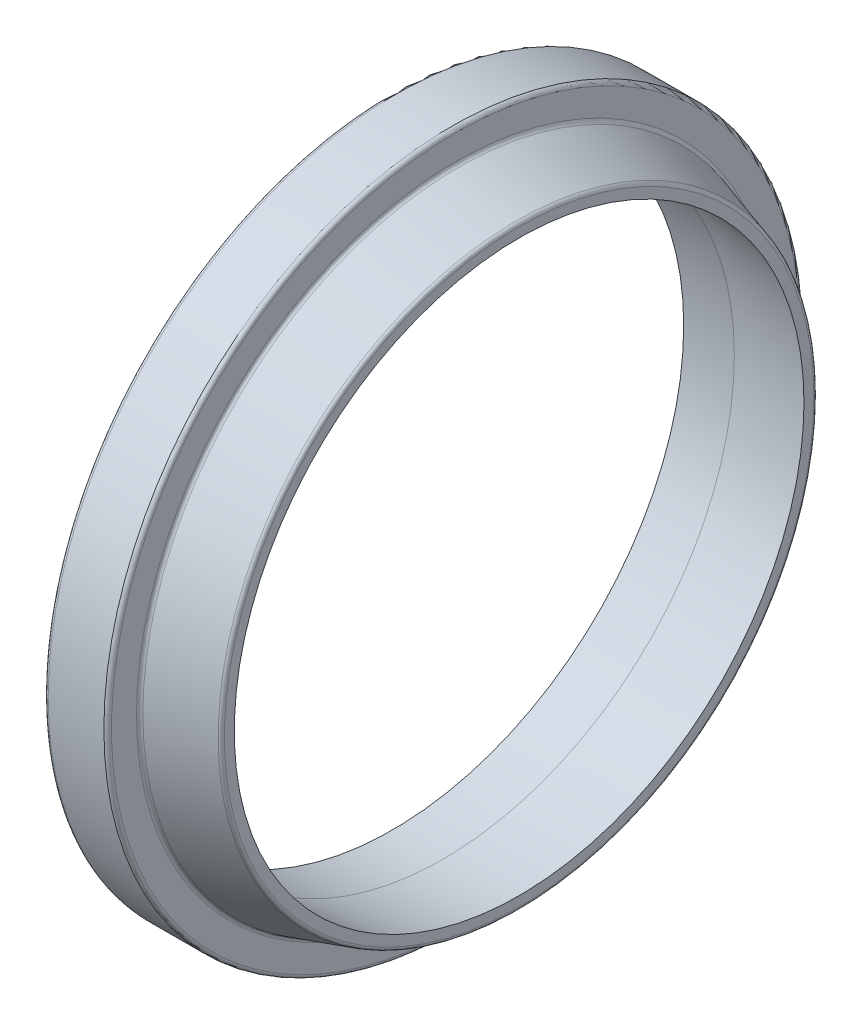
ISO-10303-21;
HEADER;
FILE_DESCRIPTION(('STEP AP214'),'2;1');
FILE_NAME('part.step','',(''),(''),'','','');
FILE_SCHEMA(('AUTOMOTIVE_DESIGN { 1 0 10303 214 1 1 1 1 }'));
ENDSEC;
DATA;
#1=APPLICATION_CONTEXT('core data for automotive mechanical design processes');
#2=APPLICATION_PROTOCOL_DEFINITION('international standard','automotive_design',2000,#1);
#3=PRODUCT_CONTEXT('',#1,'mechanical');
#4=PRODUCT('Part','Part','',(#3));
#5=PRODUCT_RELATED_PRODUCT_CATEGORY('part','',(#4));
#6=PRODUCT_DEFINITION_FORMATION('','',#4);
#7=PRODUCT_DEFINITION_CONTEXT('part definition',#1,'design');
#8=PRODUCT_DEFINITION('design','',#6,#7);
#9=PRODUCT_DEFINITION_SHAPE('','',#8);
#10=(LENGTH_UNIT() NAMED_UNIT(*) SI_UNIT(.MILLI.,.METRE.));
#11=(NAMED_UNIT(*) PLANE_ANGLE_UNIT() SI_UNIT($,.RADIAN.));
#12=(NAMED_UNIT(*) SI_UNIT($,.STERADIAN.) SOLID_ANGLE_UNIT());
#13=UNCERTAINTY_MEASURE_WITH_UNIT(LENGTH_MEASURE(1.E-05),#10,'distance_accuracy_value','');
#14=(GEOMETRIC_REPRESENTATION_CONTEXT(3) GLOBAL_UNCERTAINTY_ASSIGNED_CONTEXT((#13)) GLOBAL_UNIT_ASSIGNED_CONTEXT((#10,
#11,#12)) REPRESENTATION_CONTEXT('',''));
#15=CARTESIAN_POINT('',(0.,0.,0.));
#16=DIRECTION('',(0.,0.,1.));
#17=DIRECTION('',(1.,0.,0.));
#18=AXIS2_PLACEMENT_3D('',#15,#16,#17);
#19=CARTESIAN_POINT('',(4.,-22.5,0.));
#20=DIRECTION('',(-1.,0.,0.));
#21=DIRECTION('',(0.,0.,1.));
#22=AXIS2_PLACEMENT_3D('',#19,#20,#21);
#23=CONICAL_SURFACE('',#22,23.,0.0831412318884413);
#24=CARTESIAN_POINT('',(10.,-22.5,0.));
#25=DIRECTION('',(1.,0.,0.));
#26=DIRECTION('',(0.,0.,-1.));
#27=AXIS2_PLACEMENT_3D('',#24,#25,#26);
#28=CIRCLE('',#27,22.5);
#29=CARTESIAN_POINT('',(10.,-22.5,-22.5));
#30=VERTEX_POINT('',#29);
#31=EDGE_CURVE('E10',#30,#30,#28,.T.);
#32=ORIENTED_EDGE('',*,*,#31,.T.);
#33=EDGE_LOOP('',(#32));
#34=FACE_BOUND('',#33,.T.);
#35=CARTESIAN_POINT('',(4.,-22.5,0.));
#36=DIRECTION('',(1.,0.,0.));
#37=DIRECTION('',(0.,0.,-1.));
#38=AXIS2_PLACEMENT_3D('',#35,#36,#37);
#39=CIRCLE('',#38,23.);
#40=CARTESIAN_POINT('',(4.,-22.5,-23.));
#41=VERTEX_POINT('',#40);
#42=EDGE_CURVE('E90',#41,#41,#39,.T.);
#43=ORIENTED_EDGE('',*,*,#42,.F.);
#44=EDGE_LOOP('',(#43));
#45=FACE_BOUND('',#44,.T.);
#46=ADVANCED_FACE('F43',(#34,#45),#23,.F.);
#47=CARTESIAN_POINT('',(10.,0.776790804732682,0.));
#48=DIRECTION('',(1.,0.,0.));
#49=DIRECTION('',(0.,0.,-1.));
#50=AXIS2_PLACEMENT_3D('',#47,#48,#49);
#51=PLANE('',#50);
#52=CARTESIAN_POINT('',(10.,-22.5,0.));
#53=DIRECTION('',(1.,0.,0.));
#54=DIRECTION('',(0.,0.,-1.));
#55=AXIS2_PLACEMENT_3D('',#52,#53,#54);
#56=CIRCLE('',#55,23.2767908047327);
#57=CARTESIAN_POINT('',(10.,-22.5,-23.2767908047327));
#58=VERTEX_POINT('',#57);
#59=EDGE_CURVE('E50',#58,#58,#56,.T.);
#60=ORIENTED_EDGE('',*,*,#59,.T.);
#61=EDGE_LOOP('',(#60));
#62=FACE_BOUND('',#61,.T.);
#63=ORIENTED_EDGE('',*,*,#31,.F.);
#64=EDGE_LOOP('',(#63));
#65=FACE_BOUND('',#64,.T.);
#66=ADVANCED_FACE('F99',(#62,#65),#51,.T.);
#67=CARTESIAN_POINT('',(9.7,-22.5,0.));
#68=DIRECTION('',(1.,0.,0.));
#69=DIRECTION('',(0.,0.,-1.));
#70=AXIS2_PLACEMENT_3D('',#67,#68,#69);
#71=TOROIDAL_SURFACE('',#70,23.2767908047327,0.3);
#72=CARTESIAN_POINT('',(9.7862043656699,-22.5,0.));
#73=DIRECTION('',(1.,0.,0.));
#74=DIRECTION('',(0.,0.,-1.));
#75=AXIS2_PLACEMENT_3D('',#72,#73,#74);
#76=CIRCLE('',#75,23.564138690299);
#77=CARTESIAN_POINT('',(9.7862043656699,-22.5,-23.564138690299));
#78=VERTEX_POINT('',#77);
#79=EDGE_CURVE('E55',#78,#78,#76,.T.);
#80=ORIENTED_EDGE('',*,*,#79,.T.);
#81=EDGE_LOOP('',(#80));
#82=FACE_BOUND('',#81,.T.);
#83=ORIENTED_EDGE('',*,*,#59,.F.);
#84=EDGE_LOOP('',(#83));
#85=FACE_BOUND('',#84,.T.);
#86=ADVANCED_FACE('F103',(#82,#85),#71,.T.);
#87=CARTESIAN_POINT('',(9.7862043656699,-22.5,0.));
#88=DIRECTION('',(-1.,0.,0.));
#89=DIRECTION('',(0.,0.,1.));
#90=AXIS2_PLACEMENT_3D('',#87,#88,#89);
#91=CONICAL_SURFACE('',#90,23.564138690299,0.291456794477867);
#92=CARTESIAN_POINT('',(5.2137956343301,-22.5,0.));
#93=DIRECTION('',(1.,0.,0.));
#94=DIRECTION('',(0.,0.,-1.));
#95=AXIS2_PLACEMENT_3D('',#92,#93,#94);
#96=CIRCLE('',#95,24.935861309701);
#97=CARTESIAN_POINT('',(5.2137956343301,-22.5,-24.935861309701));
#98=VERTEX_POINT('',#97);
#99=EDGE_CURVE('E60',#98,#98,#96,.T.);
#100=ORIENTED_EDGE('',*,*,#99,.T.);
#101=EDGE_LOOP('',(#100));
#102=FACE_BOUND('',#101,.T.);
#103=ORIENTED_EDGE('',*,*,#79,.F.);
#104=EDGE_LOOP('',(#103));
#105=FACE_BOUND('',#104,.T.);
#106=ADVANCED_FACE('F107',(#102,#105),#91,.T.);
#107=CARTESIAN_POINT('',(5.3,-22.5,0.));
#108=DIRECTION('',(1.,0.,0.));
#109=DIRECTION('',(0.,0.,-1.));
#110=AXIS2_PLACEMENT_3D('',#107,#108,#109);
#111=TOROIDAL_SURFACE('',#110,25.2232091952673,0.3);
#112=CARTESIAN_POINT('',(5.,-22.5,0.));
#113=DIRECTION('',(1.,0.,0.));
#114=DIRECTION('',(0.,0.,-1.));
#115=AXIS2_PLACEMENT_3D('',#112,#113,#114);
#116=CIRCLE('',#115,25.2232091952673);
#117=CARTESIAN_POINT('',(5.,-22.5,-25.2232091952673));
#118=VERTEX_POINT('',#117);
#119=EDGE_CURVE('E66',#118,#118,#116,.T.);
#120=ORIENTED_EDGE('',*,*,#119,.T.);
#121=EDGE_LOOP('',(#120));
#122=FACE_BOUND('',#121,.T.);
#123=ORIENTED_EDGE('',*,*,#99,.F.);
#124=EDGE_LOOP('',(#123));
#125=FACE_BOUND('',#124,.T.);
#126=ADVANCED_FACE('F114',(#122,#125),#111,.F.);
#127=CARTESIAN_POINT('',(5.,4.7,0.));
#128=DIRECTION('',(1.,0.,0.));
#129=DIRECTION('',(0.,0.,-1.));
#130=AXIS2_PLACEMENT_3D('',#127,#128,#129);
#131=PLANE('',#130);
#132=CARTESIAN_POINT('',(5.,-22.5,0.));
#133=DIRECTION('',(1.,0.,0.));
#134=DIRECTION('',(0.,0.,-1.));
#135=AXIS2_PLACEMENT_3D('',#132,#133,#134);
#136=CIRCLE('',#135,27.2);
#137=CARTESIAN_POINT('',(5.,-22.5,-27.2));
#138=VERTEX_POINT('',#137);
#139=EDGE_CURVE('E70',#138,#138,#136,.T.);
#140=ORIENTED_EDGE('',*,*,#139,.T.);
#141=EDGE_LOOP('',(#140));
#142=FACE_BOUND('',#141,.T.);
#143=ORIENTED_EDGE('',*,*,#119,.F.);
#144=EDGE_LOOP('',(#143));
#145=FACE_BOUND('',#144,.T.);
#146=ADVANCED_FACE('F118',(#142,#145),#131,.T.);
#147=CARTESIAN_POINT('',(4.7,-22.5,0.));
#148=DIRECTION('',(1.,0.,0.));
#149=DIRECTION('',(0.,0.,-1.));
#150=AXIS2_PLACEMENT_3D('',#147,#148,#149);
#151=TOROIDAL_SURFACE('',#150,27.2,0.3);
#152=CARTESIAN_POINT('',(4.7,-22.5,0.));
#153=DIRECTION('',(1.,0.,0.));
#154=DIRECTION('',(0.,0.,-1.));
#155=AXIS2_PLACEMENT_3D('',#152,#153,#154);
#156=CIRCLE('',#155,27.5);
#157=CARTESIAN_POINT('',(4.7,-22.5,-27.5));
#158=VERTEX_POINT('',#157);
#159=EDGE_CURVE('E74',#158,#158,#156,.T.);
#160=ORIENTED_EDGE('',*,*,#159,.T.);
#161=EDGE_LOOP('',(#160));
#162=FACE_BOUND('',#161,.T.);
#163=ORIENTED_EDGE('',*,*,#139,.F.);
#164=EDGE_LOOP('',(#163));
#165=FACE_BOUND('',#164,.T.);
#166=ADVANCED_FACE('F122',(#162,#165),#151,.T.);
#167=CARTESIAN_POINT('',(10.,-22.5,0.));
#168=DIRECTION('',(1.,0.,0.));
#169=DIRECTION('',(0.,0.,-1.));
#170=AXIS2_PLACEMENT_3D('',#167,#168,#169);
#171=CYLINDRICAL_SURFACE('',#170,27.5);
#172=CARTESIAN_POINT('',(0.300000000000002,-22.5,0.));
#173=DIRECTION('',(1.,0.,0.));
#174=DIRECTION('',(0.,0.,-1.));
#175=AXIS2_PLACEMENT_3D('',#172,#173,#174);
#176=CIRCLE('',#175,27.5);
#177=CARTESIAN_POINT('',(0.300000000000002,-22.5,-27.5));
#178=VERTEX_POINT('',#177);
#179=EDGE_CURVE('E78',#178,#178,#176,.T.);
#180=ORIENTED_EDGE('',*,*,#179,.T.);
#181=EDGE_LOOP('',(#180));
#182=FACE_BOUND('',#181,.T.);
#183=ORIENTED_EDGE('',*,*,#159,.F.);
#184=EDGE_LOOP('',(#183));
#185=FACE_BOUND('',#184,.T.);
#186=ADVANCED_FACE('F126',(#182,#185),#171,.T.);
#187=CARTESIAN_POINT('',(0.3,-22.5,0.));
#188=DIRECTION('',(1.,0.,0.));
#189=DIRECTION('',(0.,0.,-1.));
#190=AXIS2_PLACEMENT_3D('',#187,#188,#189);
#191=TOROIDAL_SURFACE('',#190,27.2,0.3);
#192=CARTESIAN_POINT('',(0.,-22.5,0.));
#193=DIRECTION('',(1.,0.,0.));
#194=DIRECTION('',(0.,0.,-1.));
#195=AXIS2_PLACEMENT_3D('',#192,#193,#194);
#196=CIRCLE('',#195,27.2);
#197=CARTESIAN_POINT('',(0.,-22.5,-27.2));
#198=VERTEX_POINT('',#197);
#199=EDGE_CURVE('E82',#198,#198,#196,.T.);
#200=ORIENTED_EDGE('',*,*,#199,.T.);
#201=EDGE_LOOP('',(#200));
#202=FACE_BOUND('',#201,.T.);
#203=ORIENTED_EDGE('',*,*,#179,.F.);
#204=EDGE_LOOP('',(#203));
#205=FACE_BOUND('',#204,.T.);
#206=ADVANCED_FACE('F130',(#202,#205),#191,.T.);
#207=CARTESIAN_POINT('',(0.,4.7,0.));
#208=DIRECTION('',(-1.,0.,0.));
#209=DIRECTION('',(0.,0.,1.));
#210=AXIS2_PLACEMENT_3D('',#207,#208,#209);
#211=PLANE('',#210);
#212=CARTESIAN_POINT('',(0.,-22.5,0.));
#213=DIRECTION('',(1.,0.,0.));
#214=DIRECTION('',(0.,0.,-1.));
#215=AXIS2_PLACEMENT_3D('',#212,#213,#214);
#216=CIRCLE('',#215,23.);
#217=CARTESIAN_POINT('',(0.,-22.5,-23.));
#218=VERTEX_POINT('',#217);
#219=EDGE_CURVE('E86',#218,#218,#216,.T.);
#220=ORIENTED_EDGE('',*,*,#219,.T.);
#221=EDGE_LOOP('',(#220));
#222=FACE_BOUND('',#221,.T.);
#223=ORIENTED_EDGE('',*,*,#199,.F.);
#224=EDGE_LOOP('',(#223));
#225=FACE_BOUND('',#224,.T.);
#226=ADVANCED_FACE('F134',(#222,#225),#211,.T.);
#227=CARTESIAN_POINT('',(10.,-22.5,0.));
#228=DIRECTION('',(1.,0.,0.));
#229=DIRECTION('',(0.,0.,-1.));
#230=AXIS2_PLACEMENT_3D('',#227,#228,#229);
#231=CYLINDRICAL_SURFACE('',#230,23.);
#232=ORIENTED_EDGE('',*,*,#42,.T.);
#233=EDGE_LOOP('',(#232));
#234=FACE_BOUND('',#233,.T.);
#235=ORIENTED_EDGE('',*,*,#219,.F.);
#236=EDGE_LOOP('',(#235));
#237=FACE_BOUND('',#236,.T.);
#238=ADVANCED_FACE('F95',(#234,#237),#231,.F.);
#239=CLOSED_SHELL('',(#46,#66,#86,#106,#126,#146,#166,#186,#206,#226,#238));
#240=MANIFOLD_SOLID_BREP('B2',#239);
#241=ADVANCED_BREP_SHAPE_REPRESENTATION('',(#18,#240),#14);
#242=SHAPE_DEFINITION_REPRESENTATION(#9,#241);
ENDSEC;
END-ISO-10303-21;
